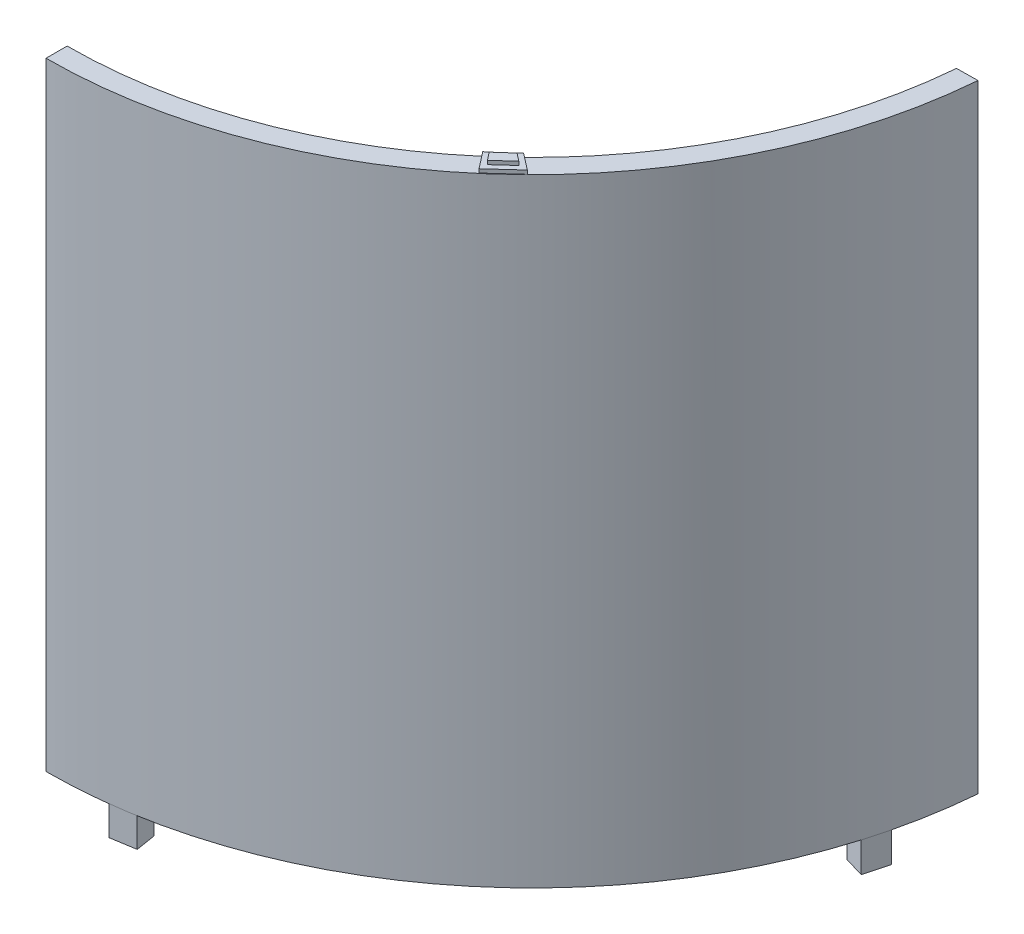
ISO-10303-21;
HEADER;
FILE_DESCRIPTION(('STEP AP214'),'2;1');
FILE_NAME('part.step','',(''),(''),'','','');
FILE_SCHEMA(('AUTOMOTIVE_DESIGN { 1 0 10303 214 1 1 1 1 }'));
ENDSEC;
DATA;
#1=APPLICATION_CONTEXT('core data for automotive mechanical design processes');
#2=APPLICATION_PROTOCOL_DEFINITION('international standard','automotive_design',2000,#1);
#3=PRODUCT_CONTEXT('',#1,'mechanical');
#4=PRODUCT('Part','Part','',(#3));
#5=PRODUCT_RELATED_PRODUCT_CATEGORY('part','',(#4));
#6=PRODUCT_DEFINITION_FORMATION('','',#4);
#7=PRODUCT_DEFINITION_CONTEXT('part definition',#1,'design');
#8=PRODUCT_DEFINITION('design','',#6,#7);
#9=PRODUCT_DEFINITION_SHAPE('','',#8);
#10=(LENGTH_UNIT() NAMED_UNIT(*) SI_UNIT(.MILLI.,.METRE.));
#11=(NAMED_UNIT(*) PLANE_ANGLE_UNIT() SI_UNIT($,.RADIAN.));
#12=(NAMED_UNIT(*) SI_UNIT($,.STERADIAN.) SOLID_ANGLE_UNIT());
#13=UNCERTAINTY_MEASURE_WITH_UNIT(LENGTH_MEASURE(1.E-05),#10,'distance_accuracy_value','');
#14=(GEOMETRIC_REPRESENTATION_CONTEXT(3) GLOBAL_UNCERTAINTY_ASSIGNED_CONTEXT((#13)) GLOBAL_UNIT_ASSIGNED_CONTEXT((#10,
#11,#12)) REPRESENTATION_CONTEXT('',''));
#15=CARTESIAN_POINT('',(0.,0.,0.));
#16=DIRECTION('',(0.,0.,1.));
#17=DIRECTION('',(1.,0.,0.));
#18=AXIS2_PLACEMENT_3D('',#15,#16,#17);
#19=CARTESIAN_POINT('',(0.,0.,0.));
#20=DIRECTION('',(0.,1.,0.));
#21=DIRECTION('',(0.,0.,1.));
#22=AXIS2_PLACEMENT_3D('',#19,#20,#21);
#23=PLANE('',#22);
#24=DIRECTION('',(0.971876517470432,0.,0.235491050338533));
#25=VECTOR('',#24,1.);
#26=CARTESIAN_POINT('',(43.6933956911305,0.,10.5871512061484));
#27=LINE('',#26,#25);
#28=CARTESIAN_POINT('',(43.6933956911305,0.,10.5871512061484));
#29=VERTEX_POINT('',#28);
#30=CARTESIAN_POINT('',(45.675093066908,0.,11.0673274302737));
#31=VERTEX_POINT('',#30);
#32=EDGE_CURVE('E355',#29,#31,#27,.T.);
#33=ORIENTED_EDGE('',*,*,#32,.F.);
#34=CARTESIAN_POINT('',(0.,0.,0.));
#35=DIRECTION('',(0.,-1.,0.));
#36=DIRECTION('',(0.,0.,1.));
#37=AXIS2_PLACEMENT_3D('',#34,#35,#36);
#38=CIRCLE('',#37,44.9577645983822);
#39=CARTESIAN_POINT('',(44.7877184769488,0.,3.90651651898813));
#40=VERTEX_POINT('',#39);
#41=EDGE_CURVE('E534',#40,#29,#38,.T.);
#42=ORIENTED_EDGE('',*,*,#41,.F.);
#43=DIRECTION('',(-0.999921849974526,0.,0.0125017576172964));
#44=VECTOR('',#43,1.);
#45=CARTESIAN_POINT('',(44.7877184769488,0.,3.90651651898813));
#46=LINE('',#45,#44);
#47=CARTESIAN_POINT('',(46.8362941470503,0.,3.880903720859));
#48=VERTEX_POINT('',#47);
#49=EDGE_CURVE('E390',#48,#40,#46,.T.);
#50=ORIENTED_EDGE('',*,*,#49,.F.);
#51=CARTESIAN_POINT('',(0.,0.,0.));
#52=DIRECTION('',(0.,1.,0.));
#53=DIRECTION('',(0.,0.,1.));
#54=AXIS2_PLACEMENT_3D('',#51,#52,#53);
#55=CIRCLE('',#54,46.996806946);
#56=EDGE_CURVE('E383',#31,#48,#55,.T.);
#57=ORIENTED_EDGE('',*,*,#56,.F.);
#58=EDGE_LOOP('',(#33,#42,#50,#57));
#59=FACE_BOUND('',#58,.T.);
#60=ADVANCED_FACE('F194',(#59),#23,.F.);
#61=DIRECTION('',(-0.260127673447546,0.,0.96557422993096));
#62=VECTOR('',#61,1.);
#63=CARTESIAN_POINT('',(45.675093066908,0.,11.0673274302737));
#64=LINE('',#63,#62);
#65=CARTESIAN_POINT('',(45.0533725626075,0.,13.3751068726376));
#66=VERTEX_POINT('',#65);
#67=EDGE_CURVE('E343',#31,#66,#64,.T.);
#68=ORIENTED_EDGE('',*,*,#67,.F.);
#69=EDGE_CURVE('E379',#66,#31,#55,.T.);
#70=ORIENTED_EDGE('',*,*,#69,.F.);
#71=EDGE_LOOP('',(#68,#70));
#72=FACE_BOUND('',#71,.T.);
#73=ADVANCED_FACE('F380',(#72),#23,.F.);
#74=DIRECTION('',(-0.958647522891811,0.,-0.284596076665501));
#75=VECTOR('',#74,1.);
#76=CARTESIAN_POINT('',(45.0533725626075,0.,13.3751068726376));
#77=LINE('',#76,#75);
#78=CARTESIAN_POINT('',(43.0986496669923,0.,12.7948034203508));
#79=VERTEX_POINT('',#78);
#80=EDGE_CURVE('E356',#66,#79,#77,.T.);
#81=ORIENTED_EDGE('',*,*,#80,.F.);
#82=CARTESIAN_POINT('',(0.,0.,46.996806946));
#83=VERTEX_POINT('',#82);
#84=EDGE_CURVE('E372',#83,#66,#55,.T.);
#85=ORIENTED_EDGE('',*,*,#84,.F.);
#86=DIRECTION('',(0.,0.,1.));
#87=VECTOR('',#86,1.);
#88=CARTESIAN_POINT('',(0.,0.,44.9577645983822));
#89=LINE('',#88,#87);
#90=CARTESIAN_POINT('',(0.,0.,44.9577645983822));
#91=VERTEX_POINT('',#90);
#92=EDGE_CURVE('E457',#91,#83,#89,.T.);
#93=ORIENTED_EDGE('',*,*,#92,.F.);
#94=CARTESIAN_POINT('',(6.65795686596446,0.,44.4620310833244));
#95=VERTEX_POINT('',#94);
#96=EDGE_CURVE('E392',#95,#91,#38,.T.);
#97=ORIENTED_EDGE('',*,*,#96,.F.);
#98=DIRECTION('',(0.987163140641952,0.,-0.159715164458223));
#99=VECTOR('',#98,1.);
#100=CARTESIAN_POINT('',(7.70192334124644,0.,44.2931255899729));
#101=LINE('',#100,#99);
#102=CARTESIAN_POINT('',(5.35189982980112,0.,44.6733407501207));
#103=VERTEX_POINT('',#102);
#104=EDGE_CURVE('E219',#103,#95,#101,.T.);
#105=ORIENTED_EDGE('',*,*,#104,.F.);
#106=DIRECTION('',(-0.159715164458223,0.,-0.987163140641952));
#107=VECTOR('',#106,1.);
#108=CARTESIAN_POINT('',(5.35189982980112,0.,44.6733407501207));
#109=LINE('',#108,#107);
#110=CARTESIAN_POINT('',(5.66110665279664,0.,46.5844778643177));
#111=VERTEX_POINT('',#110);
#112=EDGE_CURVE('E564',#111,#103,#109,.T.);
#113=ORIENTED_EDGE('',*,*,#112,.F.);
#114=DIRECTION('',(-0.987163140641952,0.,0.159715164458223));
#115=VECTOR('',#114,1.);
#116=CARTESIAN_POINT('',(5.66110665279664,0.,46.5844778643177));
#117=LINE('',#116,#115);
#118=CARTESIAN_POINT('',(8.01113016424196,0.,46.2042627041699));
#119=VERTEX_POINT('',#118);
#120=EDGE_CURVE('E571',#119,#111,#117,.T.);
#121=ORIENTED_EDGE('',*,*,#120,.F.);
#122=DIRECTION('',(0.159715164458223,0.,0.987163140641952));
#123=VECTOR('',#122,1.);
#124=CARTESIAN_POINT('',(8.01113016424196,0.,46.2042627041699));
#125=LINE('',#124,#123);
#126=CARTESIAN_POINT('',(7.70192334124497,0.,44.2931255899732));
#127=VERTEX_POINT('',#126);
#128=EDGE_CURVE('E574',#127,#119,#125,.T.);
#129=ORIENTED_EDGE('',*,*,#128,.F.);
#130=EDGE_CURVE('E198',#79,#127,#38,.T.);
#131=ORIENTED_EDGE('',*,*,#130,.F.);
#132=EDGE_LOOP('',(#81,#85,#93,#97,#105,#113,#121,#129,#131));
#133=FACE_BOUND('',#132,.T.);
#134=ADVANCED_FACE('F369',(#133),#23,.F.);
#135=CARTESIAN_POINT('',(0.,59.622930538,0.));
#136=DIRECTION('',(0.,1.,0.));
#137=DIRECTION('',(0.,0.,1.));
#138=AXIS2_PLACEMENT_3D('',#135,#136,#137);
#139=PLANE('',#138);
#140=CARTESIAN_POINT('',(0.,59.622930538,0.));
#141=DIRECTION('',(0.,-1.,0.));
#142=DIRECTION('',(0.,0.,1.));
#143=AXIS2_PLACEMENT_3D('',#140,#141,#142);
#144=CIRCLE('',#143,44.9577645983822);
#145=CARTESIAN_POINT('',(44.7877184769488,59.622930538,3.90651651898813));
#146=VERTEX_POINT('',#145);
#147=CARTESIAN_POINT('',(31.3359106757,59.622930538,32.2375758984465));
#148=VERTEX_POINT('',#147);
#149=EDGE_CURVE('E469',#146,#148,#144,.T.);
#150=ORIENTED_EDGE('',*,*,#149,.T.);
#151=DIRECTION('',(0.79089169625054,0.,0.611956146142796));
#152=VECTOR('',#151,1.);
#153=CARTESIAN_POINT('',(31.3359106757,59.622930538,32.2375758984465));
#154=LINE('',#153,#152);
#155=CARTESIAN_POINT('',(32.9319416248508,59.622930538,33.4725123042746));
#156=VERTEX_POINT('',#155);
#157=EDGE_CURVE('E408',#148,#156,#154,.T.);
#158=ORIENTED_EDGE('',*,*,#157,.T.);
#159=DIRECTION('',(-0.739524969403038,0.,0.673129125524543));
#160=VECTOR('',#159,1.);
#161=CARTESIAN_POINT('',(32.9319416248508,59.622930538,33.4725123042746));
#162=LINE('',#161,#160);
#163=CARTESIAN_POINT('',(30.4908808828723,59.622930538,35.6944103477264));
#164=VERTEX_POINT('',#163);
#165=EDGE_CURVE('E709',#156,#164,#162,.T.);
#166=ORIENTED_EDGE('',*,*,#165,.T.);
#167=DIRECTION('',(-0.612992155064147,0.,-0.790088993613892));
#168=VECTOR('',#167,1.);
#169=CARTESIAN_POINT('',(29.2476680121748,59.622930538,34.0920263730826));
#170=LINE('',#169,#168);
#171=CARTESIAN_POINT('',(29.2716246217053,59.622930538,34.1229041801768));
#172=VERTEX_POINT('',#171);
#173=EDGE_CURVE('E484',#164,#172,#170,.T.);
#174=ORIENTED_EDGE('',*,*,#173,.T.);
#175=CARTESIAN_POINT('',(0.,59.622930538,44.9577645983822));
#176=VERTEX_POINT('',#175);
#177=EDGE_CURVE('E460',#172,#176,#144,.T.);
#178=ORIENTED_EDGE('',*,*,#177,.T.);
#179=DIRECTION('',(0.,0.,1.));
#180=VECTOR('',#179,1.);
#181=CARTESIAN_POINT('',(0.,59.622930538,44.9577645983822));
#182=LINE('',#181,#180);
#183=CARTESIAN_POINT('',(0.,59.622930538,46.996806946));
#184=VERTEX_POINT('',#183);
#185=EDGE_CURVE('E462',#176,#184,#182,.T.);
#186=ORIENTED_EDGE('',*,*,#185,.T.);
#187=CARTESIAN_POINT('',(0.,59.622930538,0.));
#188=DIRECTION('',(0.,1.,0.));
#189=DIRECTION('',(0.,0.,1.));
#190=AXIS2_PLACEMENT_3D('',#187,#188,#189);
#191=CIRCLE('',#190,46.996806946);
#192=CARTESIAN_POINT('',(46.8362941470503,59.622930538,3.880903720859));
#193=VERTEX_POINT('',#192);
#194=EDGE_CURVE('E447',#184,#193,#191,.T.);
#195=ORIENTED_EDGE('',*,*,#194,.T.);
#196=DIRECTION('',(-0.999921849974526,0.,0.0125017576172964));
#197=VECTOR('',#196,1.);
#198=CARTESIAN_POINT('',(44.7877184769488,59.622930538,3.90651651898813));
#199=LINE('',#198,#197);
#200=EDGE_CURVE('E456',#193,#146,#199,.T.);
#201=ORIENTED_EDGE('',*,*,#200,.T.);
#202=EDGE_LOOP('',(#150,#158,#166,#174,#178,#186,#195,#201));
#203=FACE_BOUND('',#202,.T.);
#204=ADVANCED_FACE('F481',(#203),#139,.T.);
#205=CARTESIAN_POINT('',(0.,59.622930538,0.));
#206=DIRECTION('',(0.,-1.,0.));
#207=DIRECTION('',(0.,0.,-1.));
#208=AXIS2_PLACEMENT_3D('',#205,#206,#207);
#209=CYLINDRICAL_SURFACE('',#208,46.996806946);
#210=ORIENTED_EDGE('',*,*,#84,.T.);
#211=ORIENTED_EDGE('',*,*,#69,.T.);
#212=ORIENTED_EDGE('',*,*,#56,.T.);
#213=DIRECTION('',(0.,-1.,0.));
#214=VECTOR('',#213,1.);
#215=CARTESIAN_POINT('',(46.8362941470503,59.622930538,3.880903720859));
#216=LINE('',#215,#214);
#217=EDGE_CURVE('E205',#193,#48,#216,.T.);
#218=ORIENTED_EDGE('',*,*,#217,.F.);
#219=ORIENTED_EDGE('',*,*,#194,.F.);
#220=DIRECTION('',(0.,-1.,0.));
#221=VECTOR('',#220,1.);
#222=CARTESIAN_POINT('',(0.,59.622930538,46.996806946));
#223=LINE('',#222,#221);
#224=EDGE_CURVE('E388',#184,#83,#223,.T.);
#225=ORIENTED_EDGE('',*,*,#224,.T.);
#226=EDGE_LOOP('',(#210,#211,#212,#218,#219,#225));
#227=FACE_BOUND('',#226,.T.);
#228=ADVANCED_FACE('F196',(#227),#209,.T.);
#229=CARTESIAN_POINT('',(44.7877184769488,59.622930538,3.90651651898813));
#230=DIRECTION('',(0.0125017576172964,0.,0.999921849974526));
#231=DIRECTION('',(0.999921849974526,0.,-0.0125017576172964));
#232=AXIS2_PLACEMENT_3D('',#229,#230,#231);
#233=PLANE('',#232);
#234=ORIENTED_EDGE('',*,*,#49,.T.);
#235=DIRECTION('',(0.,-1.,0.));
#236=VECTOR('',#235,1.);
#237=CARTESIAN_POINT('',(44.7877184769488,59.622930538,3.90651651898813));
#238=LINE('',#237,#236);
#239=EDGE_CURVE('E493',#146,#40,#238,.T.);
#240=ORIENTED_EDGE('',*,*,#239,.F.);
#241=ORIENTED_EDGE('',*,*,#200,.F.);
#242=ORIENTED_EDGE('',*,*,#217,.T.);
#243=EDGE_LOOP('',(#234,#240,#241,#242));
#244=FACE_BOUND('',#243,.T.);
#245=ADVANCED_FACE('F508',(#244),#233,.F.);
#246=CARTESIAN_POINT('',(0.,59.622930538,0.));
#247=DIRECTION('',(0.,-1.,0.));
#248=DIRECTION('',(0.,0.,-1.));
#249=AXIS2_PLACEMENT_3D('',#246,#247,#248);
#250=CYLINDRICAL_SURFACE('',#249,44.9577645983822);
#251=ORIENTED_EDGE('',*,*,#41,.T.);
#252=EDGE_CURVE('E542',#29,#79,#38,.T.);
#253=ORIENTED_EDGE('',*,*,#252,.T.);
#254=ORIENTED_EDGE('',*,*,#130,.T.);
#255=CARTESIAN_POINT('',(0.,0.,0.));
#256=DIRECTION('',(0.,-1.,0.));
#257=DIRECTION('',(0.171314641865493,0.,0.985216368866504));
#258=AXIS2_PLACEMENT_3D('',#255,#256,#257);
#259=CIRCLE('',#258,44.9577645983822);
#260=EDGE_CURVE('E549',#127,#95,#259,.T.);
#261=ORIENTED_EDGE('',*,*,#260,.T.);
#262=ORIENTED_EDGE('',*,*,#96,.T.);
#263=DIRECTION('',(0.,-1.,0.));
#264=VECTOR('',#263,1.);
#265=CARTESIAN_POINT('',(0.,59.622930538,44.9577645983822));
#266=LINE('',#265,#264);
#267=EDGE_CURVE('E487',#176,#91,#266,.T.);
#268=ORIENTED_EDGE('',*,*,#267,.F.);
#269=ORIENTED_EDGE('',*,*,#177,.F.);
#270=CARTESIAN_POINT('',(30.37739577073,59.622930538,33.142335824018));
#271=VERTEX_POINT('',#270);
#272=EDGE_CURVE('E473',#271,#172,#144,.T.);
#273=ORIENTED_EDGE('',*,*,#272,.F.);
#274=CARTESIAN_POINT('',(31.3359106757,59.622930538,32.2375758984465));
#275=CARTESIAN_POINT('',(30.8685489057334,59.622930538,32.7033074867842));
#276=CARTESIAN_POINT('',(30.37739577073,59.622930538,33.142335824018));
#277=B_SPLINE_CURVE_WITH_KNOTS('',2,(#274,#275,#276),.UNSPECIFIED.,.F.,.F.,(3,3),
(0.528237604569855,1.),.UNSPECIFIED.);
#278=EDGE_CURVE('E14',#148,#271,#277,.T.);
#279=ORIENTED_EDGE('',*,*,#278,.F.);
#280=ORIENTED_EDGE('',*,*,#149,.F.);
#281=ORIENTED_EDGE('',*,*,#239,.T.);
#282=EDGE_LOOP('',(#251,#253,#254,#261,#262,#268,#269,#273,#279,#280,#281));
#283=FACE_BOUND('',#282,.T.);
#284=ADVANCED_FACE('F489',(#283),#250,.F.);
#285=CARTESIAN_POINT('',(0.,59.622930538,44.9577645983822));
#286=DIRECTION('',(1.,0.,0.));
#287=DIRECTION('',(0.,0.,-1.));
#288=AXIS2_PLACEMENT_3D('',#285,#286,#287);
#289=PLANE('',#288);
#290=ORIENTED_EDGE('',*,*,#92,.T.);
#291=ORIENTED_EDGE('',*,*,#224,.F.);
#292=ORIENTED_EDGE('',*,*,#185,.F.);
#293=ORIENTED_EDGE('',*,*,#267,.T.);
#294=EDGE_LOOP('',(#290,#291,#292,#293));
#295=FACE_BOUND('',#294,.T.);
#296=ADVANCED_FACE('F495',(#295),#289,.F.);
#297=CARTESIAN_POINT('',(0.,59.6229305380002,0.));
#298=DIRECTION('',(0.,1.,0.));
#299=DIRECTION('',(0.,0.,1.));
#300=AXIS2_PLACEMENT_3D('',#297,#298,#299);
#301=PLANE('',#300);
#302=CARTESIAN_POINT('',(29.2476680121748,59.622930538,34.0920263730826));
#303=CARTESIAN_POINT('',(30.3452387304711,59.622930538,33.2247923295336));
#304=CARTESIAN_POINT('',(31.3359106757,59.622930538,32.2375758984465));
#305=B_SPLINE_CURVE_WITH_KNOTS('',2,(#302,#303,#304),.UNSPECIFIED.,.F.,.F.,(3,3),(0.,1.),.UNSPECIFIED.);
#306=CARTESIAN_POINT('',(29.2476680121748,59.622930538,34.0920263730826));
#307=VERTEX_POINT('',#306);
#308=EDGE_CURVE('E396',#307,#271,#305,.T.);
#309=ORIENTED_EDGE('',*,*,#308,.T.);
#310=ORIENTED_EDGE('',*,*,#272,.T.);
#311=EDGE_CURVE('E736',#172,#307,#170,.T.);
#312=ORIENTED_EDGE('',*,*,#311,.T.);
#313=EDGE_LOOP('',(#309,#310,#312));
#314=FACE_BOUND('',#313,.T.);
#315=ADVANCED_FACE('F439',(#314),#301,.F.);
#316=CARTESIAN_POINT('',(0.,59.9825252380002,0.));
#317=DIRECTION('',(0.,1.,0.));
#318=DIRECTION('',(0.,0.,1.));
#319=AXIS2_PLACEMENT_3D('',#316,#317,#318);
#320=PLANE('',#319);
#321=CARTESIAN_POINT('',(31.3752508033412,59.9825252380002,32.9103284828037));
#322=CARTESIAN_POINT('',(31.3491587800157,59.9825252380002,32.9353237229431));
#323=CARTESIAN_POINT('',(31.3230149632518,59.9825252380002,32.960265464837));
#324=CARTESIAN_POINT('',(31.2968248369246,59.9825252380002,32.9851589341973));
#325=CARTESIAN_POINT('',(31.1711972969571,59.9825252380002,33.1041747232081));
#326=CARTESIAN_POINT('',(31.0447591125012,59.9825252380002,33.2223229994474));
#327=CARTESIAN_POINT('',(30.9441488696777,59.9825252380002,33.3151791560881));
#328=CARTESIAN_POINT('',(30.7332127299382,59.9825252380002,33.5071695557994));
#329=CARTESIAN_POINT('',(30.5192300579891,59.9825252380002,33.6957640894488));
#330=CARTESIAN_POINT('',(30.4072221592275,59.9825252380002,33.793006773364));
#331=CARTESIAN_POINT('',(30.249718722762,59.9825252380002,33.9279314173744));
#332=CARTESIAN_POINT('',(30.0911265944853,59.9825252380002,34.0615888230446));
#333=CARTESIAN_POINT('',(30.0458628188562,59.9825252380002,34.0995240516828));
#334=CARTESIAN_POINT('',(30.0004790515619,59.9825252380002,34.1373136995801));
#335=CARTESIAN_POINT('',(29.954959434773,59.9825252380002,34.1749363530456));
#336=B_SPLINE_CURVE_WITH_KNOTS('',5,(#321,#322,#323,#324,#325,#326,#327,#328,#329,#330,#331,
#332,#333,#334,#335),.UNSPECIFIED.,.F.,.F.,(6,3,3,3,6),(0.,0.0949769551696104,0.45487183326193,
0.844772921526779,1.),.UNSPECIFIED.);
#337=CARTESIAN_POINT('',(31.3752508033412,59.9825252380002,32.9103284828037));
#338=VERTEX_POINT('',#337);
#339=CARTESIAN_POINT('',(29.954959434773,59.9825252380002,34.1749363530456));
#340=VERTEX_POINT('',#339);
#341=EDGE_CURVE('E692',#338,#340,#336,.T.);
#342=ORIENTED_EDGE('',*,*,#341,.F.);
#343=DIRECTION('',(-0.790891696060792,0.,-0.611956146388026));
#344=VECTOR('',#343,1.);
#345=CARTESIAN_POINT('',(32.1425937650942,59.9825252380002,33.5040636859563));
#346=LINE('',#345,#344);
#347=CARTESIAN_POINT('',(32.1425937650942,59.9825252380002,33.5040636859563));
#348=VERTEX_POINT('',#347);
#349=EDGE_CURVE('E792',#348,#338,#346,.T.);
#350=ORIENTED_EDGE('',*,*,#349,.F.);
#351=DIRECTION('',(0.739524969403045,0.,-0.673129125524535));
#352=VECTOR('',#351,1.);
#353=CARTESIAN_POINT('',(30.5553585685998,59.9825252380002,34.9487941332331));
#354=LINE('',#353,#352);
#355=CARTESIAN_POINT('',(30.5553585685998,59.9825252380002,34.9487941332331));
#356=VERTEX_POINT('',#355);
#357=EDGE_CURVE('E758',#356,#348,#354,.T.);
#358=ORIENTED_EDGE('',*,*,#357,.F.);
#359=DIRECTION('',(0.612992154274853,0.,0.790088994226267));
#360=VECTOR('',#359,1.);
#361=CARTESIAN_POINT('',(29.954959434773,59.9825252380002,34.1749363530456));
#362=LINE('',#361,#360);
#363=EDGE_CURVE('E744',#340,#356,#362,.T.);
#364=ORIENTED_EDGE('',*,*,#363,.F.);
#365=EDGE_LOOP('',(#342,#350,#358,#364));
#366=FACE_BOUND('',#365,.T.);
#367=CARTESIAN_POINT('',(29.2476680121748,59.982525238,34.0920263730826));
#368=CARTESIAN_POINT('',(30.3452387304711,59.982525238,33.2247923295336));
#369=CARTESIAN_POINT('',(31.3359106757,59.982525238,32.2375758984465));
#370=B_SPLINE_CURVE_WITH_KNOTS('',2,(#367,#368,#369),.UNSPECIFIED.,.F.,.F.,(3,3),(0.,1.),.UNSPECIFIED.);
#371=CARTESIAN_POINT('',(29.2476680121748,59.982525238,34.0920263730826));
#372=VERTEX_POINT('',#371);
#373=CARTESIAN_POINT('',(31.3359106757,59.982525238,32.2375758984465));
#374=VERTEX_POINT('',#373);
#375=EDGE_CURVE('E401',#372,#374,#370,.T.);
#376=ORIENTED_EDGE('',*,*,#375,.F.);
#377=DIRECTION('',(-0.612992155064147,0.,-0.790088993613892));
#378=VECTOR('',#377,1.);
#379=CARTESIAN_POINT('',(29.2476680121748,59.982525238,34.0920263730826));
#380=LINE('',#379,#378);
#381=CARTESIAN_POINT('',(30.4908808828723,59.982525238,35.6944103477264));
#382=VERTEX_POINT('',#381);
#383=EDGE_CURVE('E698',#382,#372,#380,.T.);
#384=ORIENTED_EDGE('',*,*,#383,.F.);
#385=DIRECTION('',(-0.739524969403038,0.,0.673129125524543));
#386=VECTOR('',#385,1.);
#387=CARTESIAN_POINT('',(32.9319416248508,59.982525238,33.4725123042746));
#388=LINE('',#387,#386);
#389=CARTESIAN_POINT('',(32.9319416248508,59.982525238,33.4725123042746));
#390=VERTEX_POINT('',#389);
#391=EDGE_CURVE('E723',#390,#382,#388,.T.);
#392=ORIENTED_EDGE('',*,*,#391,.F.);
#393=DIRECTION('',(0.79089169625054,0.,0.611956146142796));
#394=VECTOR('',#393,1.);
#395=CARTESIAN_POINT('',(31.3359106757,59.982525238,32.2375758984465));
#396=LINE('',#395,#394);
#397=EDGE_CURVE('E699',#374,#390,#396,.T.);
#398=ORIENTED_EDGE('',*,*,#397,.F.);
#399=EDGE_LOOP('',(#376,#384,#392,#398));
#400=FACE_BOUND('',#399,.T.);
#401=ADVANCED_FACE('F625',(#366,#400),#320,.T.);
#402=CARTESIAN_POINT('',(29.2476680121748,59.622930538,34.0920263730826));
#403=DIRECTION('',(0.790088993613892,0.,-0.612992155064147));
#404=DIRECTION('',(-0.612992155064147,0.,-0.790088993613892));
#405=AXIS2_PLACEMENT_3D('',#402,#403,#404);
#406=PLANE('',#405);
#407=ORIENTED_EDGE('',*,*,#383,.T.);
#408=DIRECTION('',(0.,1.,0.));
#409=VECTOR('',#408,1.);
#410=CARTESIAN_POINT('',(29.2476680121748,59.622930538,34.0920263730826));
#411=LINE('',#410,#409);
#412=EDGE_CURVE('E424',#307,#372,#411,.T.);
#413=ORIENTED_EDGE('',*,*,#412,.F.);
#414=ORIENTED_EDGE('',*,*,#311,.F.);
#415=ORIENTED_EDGE('',*,*,#173,.F.);
#416=DIRECTION('',(0.,1.,0.));
#417=VECTOR('',#416,1.);
#418=CARTESIAN_POINT('',(30.4908808828723,59.622930538,35.6944103477264));
#419=LINE('',#418,#417);
#420=EDGE_CURVE('E732',#164,#382,#419,.T.);
#421=ORIENTED_EDGE('',*,*,#420,.T.);
#422=EDGE_LOOP('',(#407,#413,#414,#415,#421));
#423=FACE_BOUND('',#422,.T.);
#424=ADVANCED_FACE('F629',(#423),#406,.F.);
#425=CARTESIAN_POINT('',(32.9319416248508,59.622930538,33.4725123042746));
#426=DIRECTION('',(-0.673129125524543,0.,-0.739524969403037));
#427=DIRECTION('',(-0.739524969403038,0.,0.673129125524543));
#428=AXIS2_PLACEMENT_3D('',#425,#426,#427);
#429=PLANE('',#428);
#430=ORIENTED_EDGE('',*,*,#391,.T.);
#431=ORIENTED_EDGE('',*,*,#420,.F.);
#432=ORIENTED_EDGE('',*,*,#165,.F.);
#433=DIRECTION('',(0.,1.,0.));
#434=VECTOR('',#433,1.);
#435=CARTESIAN_POINT('',(32.9319416248508,59.622930538,33.4725123042746));
#436=LINE('',#435,#434);
#437=EDGE_CURVE('E712',#156,#390,#436,.T.);
#438=ORIENTED_EDGE('',*,*,#437,.T.);
#439=EDGE_LOOP('',(#430,#431,#432,#438));
#440=FACE_BOUND('',#439,.T.);
#441=ADVANCED_FACE('F631',(#440),#429,.F.);
#442=CARTESIAN_POINT('',(31.3359106757,59.622930538,32.2375758984465));
#443=DIRECTION('',(-0.611956146142796,0.,0.79089169625054));
#444=DIRECTION('',(0.79089169625054,0.,0.611956146142796));
#445=AXIS2_PLACEMENT_3D('',#442,#443,#444);
#446=PLANE('',#445);
#447=ORIENTED_EDGE('',*,*,#397,.T.);
#448=ORIENTED_EDGE('',*,*,#437,.F.);
#449=ORIENTED_EDGE('',*,*,#157,.F.);
#450=DIRECTION('',(0.,1.,0.));
#451=VECTOR('',#450,1.);
#452=CARTESIAN_POINT('',(31.3359106757,59.622930538,32.2375758984465));
#453=LINE('',#452,#451);
#454=EDGE_CURVE('E415',#148,#374,#453,.T.);
#455=ORIENTED_EDGE('',*,*,#454,.T.);
#456=EDGE_LOOP('',(#447,#448,#449,#455));
#457=FACE_BOUND('',#456,.T.);
#458=ADVANCED_FACE('F437',(#457),#446,.F.);
#459=DIRECTION('',(0.,1.,0.));
#460=VECTOR('',#459,1.);
#461=SURFACE_OF_LINEAR_EXTRUSION('',#305,#460);
#462=ORIENTED_EDGE('',*,*,#375,.T.);
#463=ORIENTED_EDGE('',*,*,#454,.F.);
#464=ORIENTED_EDGE('',*,*,#278,.T.);
#465=ORIENTED_EDGE('',*,*,#308,.F.);
#466=ORIENTED_EDGE('',*,*,#412,.T.);
#467=EDGE_LOOP('',(#462,#463,#464,#465,#466));
#468=FACE_BOUND('',#467,.T.);
#469=ADVANCED_FACE('F431',(#468),#461,.F.);
#470=CARTESIAN_POINT('',(0.,60.3421199380002,0.));
#471=DIRECTION('',(0.,1.,0.));
#472=DIRECTION('',(0.,0.,1.));
#473=AXIS2_PLACEMENT_3D('',#470,#471,#472);
#474=PLANE('',#473);
#475=CARTESIAN_POINT('',(31.3752508033412,60.3421199380002,32.9103284828037));
#476=CARTESIAN_POINT('',(31.3491587800157,60.3421199380002,32.9353237229431));
#477=CARTESIAN_POINT('',(31.3230149632518,60.3421199380002,32.960265464837));
#478=CARTESIAN_POINT('',(31.2968248369246,60.3421199380002,32.9851589341973));
#479=CARTESIAN_POINT('',(31.1711972969571,60.3421199380002,33.1041747232081));
#480=CARTESIAN_POINT('',(31.0447591125012,60.3421199380002,33.2223229994474));
#481=CARTESIAN_POINT('',(30.9441488696777,60.3421199380002,33.3151791560881));
#482=CARTESIAN_POINT('',(30.7332127299382,60.3421199380002,33.5071695557994));
#483=CARTESIAN_POINT('',(30.5192300579891,60.3421199380002,33.6957640894488));
#484=CARTESIAN_POINT('',(30.4072221592275,60.3421199380002,33.793006773364));
#485=CARTESIAN_POINT('',(30.249718722762,60.3421199380002,33.9279314173744));
#486=CARTESIAN_POINT('',(30.0911265944853,60.3421199380002,34.0615888230446));
#487=CARTESIAN_POINT('',(30.0458628188562,60.3421199380002,34.0995240516828));
#488=CARTESIAN_POINT('',(30.0004790515619,60.3421199380002,34.1373136995801));
#489=CARTESIAN_POINT('',(29.954959434773,60.3421199380002,34.1749363530456));
#490=B_SPLINE_CURVE_WITH_KNOTS('',5,(#475,#476,#477,#478,#479,#480,#481,#482,#483,#484,#485,
#486,#487,#488,#489),.UNSPECIFIED.,.F.,.F.,(6,3,3,3,6),(0.,0.0949769551696104,0.45487183326193,
0.844772921526779,1.),.UNSPECIFIED.);
#491=CARTESIAN_POINT('',(31.3752508033412,60.3421199380002,32.9103284828037));
#492=VERTEX_POINT('',#491);
#493=CARTESIAN_POINT('',(29.954959434773,60.3421199380002,34.1749363530456));
#494=VERTEX_POINT('',#493);
#495=EDGE_CURVE('E776',#492,#494,#490,.T.);
#496=ORIENTED_EDGE('',*,*,#495,.T.);
#497=DIRECTION('',(0.612992154274853,0.,0.790088994226267));
#498=VECTOR('',#497,1.);
#499=CARTESIAN_POINT('',(29.954959434773,60.3421199380002,34.1749363530456));
#500=LINE('',#499,#498);
#501=CARTESIAN_POINT('',(30.5553585685998,60.3421199380002,34.9487941332331));
#502=VERTEX_POINT('',#501);
#503=EDGE_CURVE('E748',#494,#502,#500,.T.);
#504=ORIENTED_EDGE('',*,*,#503,.T.);
#505=DIRECTION('',(0.739524969403045,0.,-0.673129125524535));
#506=VECTOR('',#505,1.);
#507=CARTESIAN_POINT('',(30.5553585685998,60.3421199380002,34.9487941332331));
#508=LINE('',#507,#506);
#509=CARTESIAN_POINT('',(32.1425937650942,60.3421199380002,33.5040636859563));
#510=VERTEX_POINT('',#509);
#511=EDGE_CURVE('E768',#502,#510,#508,.T.);
#512=ORIENTED_EDGE('',*,*,#511,.T.);
#513=DIRECTION('',(-0.790891696060792,0.,-0.611956146388026));
#514=VECTOR('',#513,1.);
#515=CARTESIAN_POINT('',(32.1425937650942,60.3421199380002,33.5040636859563));
#516=LINE('',#515,#514);
#517=EDGE_CURVE('E799',#510,#492,#516,.T.);
#518=ORIENTED_EDGE('',*,*,#517,.T.);
#519=EDGE_LOOP('',(#496,#504,#512,#518));
#520=FACE_BOUND('',#519,.T.);
#521=ADVANCED_FACE('F436',(#520),#474,.T.);
#522=DIRECTION('',(0.,1.,0.));
#523=VECTOR('',#522,1.);
#524=SURFACE_OF_LINEAR_EXTRUSION('',#336,#523);
#525=ORIENTED_EDGE('',*,*,#495,.F.);
#526=DIRECTION('',(0.,1.,0.));
#527=VECTOR('',#526,1.);
#528=CARTESIAN_POINT('',(31.3752508033412,59.9825252380002,32.9103284828037));
#529=LINE('',#528,#527);
#530=EDGE_CURVE('E779',#338,#492,#529,.T.);
#531=ORIENTED_EDGE('',*,*,#530,.F.);
#532=ORIENTED_EDGE('',*,*,#341,.T.);
#533=DIRECTION('',(0.,1.,0.));
#534=VECTOR('',#533,1.);
#535=CARTESIAN_POINT('',(29.954959434773,59.9825252380002,34.1749363530456));
#536=LINE('',#535,#534);
#537=EDGE_CURVE('E809',#340,#494,#536,.T.);
#538=ORIENTED_EDGE('',*,*,#537,.T.);
#539=EDGE_LOOP('',(#525,#531,#532,#538));
#540=FACE_BOUND('',#539,.T.);
#541=ADVANCED_FACE('F610',(#540),#524,.T.);
#542=CARTESIAN_POINT('',(32.1425937650942,59.9825252380002,33.5040636859563));
#543=DIRECTION('',(0.611956146388026,0.,-0.790891696060792));
#544=DIRECTION('',(-0.790891696060792,0.,-0.611956146388026));
#545=AXIS2_PLACEMENT_3D('',#542,#543,#544);
#546=PLANE('',#545);
#547=ORIENTED_EDGE('',*,*,#517,.F.);
#548=DIRECTION('',(0.,1.,0.));
#549=VECTOR('',#548,1.);
#550=CARTESIAN_POINT('',(32.1425937650942,59.9825252380002,33.5040636859563));
#551=LINE('',#550,#549);
#552=EDGE_CURVE('E795',#348,#510,#551,.T.);
#553=ORIENTED_EDGE('',*,*,#552,.F.);
#554=ORIENTED_EDGE('',*,*,#349,.T.);
#555=ORIENTED_EDGE('',*,*,#530,.T.);
#556=EDGE_LOOP('',(#547,#553,#554,#555));
#557=FACE_BOUND('',#556,.T.);
#558=ADVANCED_FACE('F613',(#557),#546,.T.);
#559=CARTESIAN_POINT('',(30.5553585685998,59.9825252380002,34.9487941332331));
#560=DIRECTION('',(0.673129125524535,0.,0.739524969403045));
#561=DIRECTION('',(0.739524969403045,0.,-0.673129125524535));
#562=AXIS2_PLACEMENT_3D('',#559,#560,#561);
#563=PLANE('',#562);
#564=ORIENTED_EDGE('',*,*,#511,.F.);
#565=DIRECTION('',(0.,1.,0.));
#566=VECTOR('',#565,1.);
#567=CARTESIAN_POINT('',(30.5553585685998,59.9825252380002,34.9487941332331));
#568=LINE('',#567,#566);
#569=EDGE_CURVE('E765',#356,#502,#568,.T.);
#570=ORIENTED_EDGE('',*,*,#569,.F.);
#571=ORIENTED_EDGE('',*,*,#357,.T.);
#572=ORIENTED_EDGE('',*,*,#552,.T.);
#573=EDGE_LOOP('',(#564,#570,#571,#572));
#574=FACE_BOUND('',#573,.T.);
#575=ADVANCED_FACE('F617',(#574),#563,.T.);
#576=CARTESIAN_POINT('',(29.954959434773,59.9825252380002,34.1749363530456));
#577=DIRECTION('',(-0.790088994226267,0.,0.612992154274853));
#578=DIRECTION('',(0.612992154274853,0.,0.790088994226267));
#579=AXIS2_PLACEMENT_3D('',#576,#577,#578);
#580=PLANE('',#579);
#581=ORIENTED_EDGE('',*,*,#503,.F.);
#582=ORIENTED_EDGE('',*,*,#537,.F.);
#583=ORIENTED_EDGE('',*,*,#363,.T.);
#584=ORIENTED_EDGE('',*,*,#569,.T.);
#585=EDGE_LOOP('',(#581,#582,#583,#584));
#586=FACE_BOUND('',#585,.T.);
#587=ADVANCED_FACE('F608',(#586),#580,.T.);
#588=CARTESIAN_POINT('',(8.01113016424196,-2.89959469999999,46.2042627041699));
#589=DIRECTION('',(-0.987163140641952,0.,0.159715164458223));
#590=DIRECTION('',(0.159715164458223,0.,0.987163140641952));
#591=AXIS2_PLACEMENT_3D('',#588,#589,#590);
#592=PLANE('',#591);
#593=ORIENTED_EDGE('',*,*,#128,.T.);
#594=DIRECTION('',(0.,1.,0.));
#595=VECTOR('',#594,1.);
#596=CARTESIAN_POINT('',(8.01113016424196,-2.89959469999999,46.2042627041699));
#597=LINE('',#596,#595);
#598=CARTESIAN_POINT('',(8.01113016424196,-2.89959469999999,46.2042627041699));
#599=VERTEX_POINT('',#598);
#600=EDGE_CURVE('E780',#599,#119,#597,.T.);
#601=ORIENTED_EDGE('',*,*,#600,.F.);
#602=DIRECTION('',(0.159715164458223,0.,0.987163140641952));
#603=VECTOR('',#602,1.);
#604=CARTESIAN_POINT('',(8.01113016424196,-2.89959469999999,46.2042627041699));
#605=LINE('',#604,#603);
#606=CARTESIAN_POINT('',(7.70192334124644,-2.89959469999999,44.2931255899729));
#607=VERTEX_POINT('',#606);
#608=EDGE_CURVE('E563',#607,#599,#605,.T.);
#609=ORIENTED_EDGE('',*,*,#608,.F.);
#610=DIRECTION('',(0.,1.,0.));
#611=VECTOR('',#610,1.);
#612=CARTESIAN_POINT('',(7.70192334124644,-2.89959469999999,44.2931255899729));
#613=LINE('',#612,#611);
#614=EDGE_CURVE('E832',#607,#127,#613,.T.);
#615=ORIENTED_EDGE('',*,*,#614,.T.);
#616=EDGE_LOOP('',(#593,#601,#609,#615));
#617=FACE_BOUND('',#616,.T.);
#618=ADVANCED_FACE('F604',(#617),#592,.F.);
#619=CARTESIAN_POINT('',(5.66110665279664,-2.89959469999999,46.5844778643177));
#620=DIRECTION('',(-0.159715164458223,0.,-0.987163140641952));
#621=DIRECTION('',(-0.987163140641952,0.,0.159715164458223));
#622=AXIS2_PLACEMENT_3D('',#619,#620,#621);
#623=PLANE('',#622);
#624=ORIENTED_EDGE('',*,*,#120,.T.);
#625=DIRECTION('',(0.,1.,0.));
#626=VECTOR('',#625,1.);
#627=CARTESIAN_POINT('',(5.66110665279664,-2.89959469999999,46.5844778643177));
#628=LINE('',#627,#626);
#629=CARTESIAN_POINT('',(5.66110665279664,-2.89959469999999,46.5844778643177));
#630=VERTEX_POINT('',#629);
#631=EDGE_CURVE('E826',#630,#111,#628,.T.);
#632=ORIENTED_EDGE('',*,*,#631,.F.);
#633=DIRECTION('',(-0.987163140641952,0.,0.159715164458223));
#634=VECTOR('',#633,1.);
#635=CARTESIAN_POINT('',(5.66110665279664,-2.89959469999999,46.5844778643177));
#636=LINE('',#635,#634);
#637=EDGE_CURVE('E569',#599,#630,#636,.T.);
#638=ORIENTED_EDGE('',*,*,#637,.F.);
#639=ORIENTED_EDGE('',*,*,#600,.T.);
#640=EDGE_LOOP('',(#624,#632,#638,#639));
#641=FACE_BOUND('',#640,.T.);
#642=ADVANCED_FACE('F600',(#641),#623,.F.);
#643=CARTESIAN_POINT('',(5.35189982980112,-2.89959469999999,44.6733407501207));
#644=DIRECTION('',(0.987163140641952,0.,-0.159715164458223));
#645=DIRECTION('',(-0.159715164458223,0.,-0.987163140641952));
#646=AXIS2_PLACEMENT_3D('',#643,#644,#645);
#647=PLANE('',#646);
#648=ORIENTED_EDGE('',*,*,#112,.T.);
#649=DIRECTION('',(0.,1.,0.));
#650=VECTOR('',#649,1.);
#651=CARTESIAN_POINT('',(5.35189982980112,-2.89959469999999,44.6733407501207));
#652=LINE('',#651,#650);
#653=CARTESIAN_POINT('',(5.35189982980112,-2.89959469999999,44.6733407501207));
#654=VERTEX_POINT('',#653);
#655=EDGE_CURVE('E561',#654,#103,#652,.T.);
#656=ORIENTED_EDGE('',*,*,#655,.F.);
#657=DIRECTION('',(-0.159715164458223,0.,-0.987163140641952));
#658=VECTOR('',#657,1.);
#659=CARTESIAN_POINT('',(5.35189982980112,-2.89959469999999,44.6733407501207));
#660=LINE('',#659,#658);
#661=EDGE_CURVE('E838',#630,#654,#660,.T.);
#662=ORIENTED_EDGE('',*,*,#661,.F.);
#663=ORIENTED_EDGE('',*,*,#631,.T.);
#664=EDGE_LOOP('',(#648,#656,#662,#663));
#665=FACE_BOUND('',#664,.T.);
#666=ADVANCED_FACE('F596',(#665),#647,.F.);
#667=CARTESIAN_POINT('',(7.70192334124644,-2.89959469999999,44.2931255899729));
#668=DIRECTION('',(0.159715164458223,0.,0.987163140641952));
#669=DIRECTION('',(0.987163140641952,0.,-0.159715164458223));
#670=AXIS2_PLACEMENT_3D('',#667,#668,#669);
#671=PLANE('',#670);
#672=ORIENTED_EDGE('',*,*,#104,.T.);
#673=ORIENTED_EDGE('',*,*,#260,.F.);
#674=ORIENTED_EDGE('',*,*,#614,.F.);
#675=DIRECTION('',(0.987163140641952,0.,-0.159715164458223));
#676=VECTOR('',#675,1.);
#677=CARTESIAN_POINT('',(7.70192334124644,-2.89959469999999,44.2931255899729));
#678=LINE('',#677,#676);
#679=EDGE_CURVE('E835',#654,#607,#678,.T.);
#680=ORIENTED_EDGE('',*,*,#679,.F.);
#681=ORIENTED_EDGE('',*,*,#655,.T.);
#682=EDGE_LOOP('',(#672,#673,#674,#680,#681));
#683=FACE_BOUND('',#682,.T.);
#684=ADVANCED_FACE('F558',(#683),#671,.F.);
#685=CARTESIAN_POINT('',(0.,-2.89959469999999,0.));
#686=DIRECTION('',(0.,1.,0.));
#687=DIRECTION('',(0.,0.,1.));
#688=AXIS2_PLACEMENT_3D('',#685,#686,#687);
#689=PLANE('',#688);
#690=ORIENTED_EDGE('',*,*,#608,.T.);
#691=ORIENTED_EDGE('',*,*,#637,.T.);
#692=ORIENTED_EDGE('',*,*,#661,.T.);
#693=ORIENTED_EDGE('',*,*,#679,.T.);
#694=EDGE_LOOP('',(#690,#691,#692,#693));
#695=FACE_BOUND('',#694,.T.);
#696=ADVANCED_FACE('F595',(#695),#689,.F.);
#697=CARTESIAN_POINT('',(0.,0.,0.));
#698=DIRECTION('',(0.,-1.,0.));
#699=DIRECTION('',(0.,0.,-1.));
#700=AXIS2_PLACEMENT_3D('',#697,#698,#699);
#701=PLANE('',#700);
#702=DIRECTION('',(0.260127673447545,0.,-0.965574229930961));
#703=VECTOR('',#702,1.);
#704=CARTESIAN_POINT('',(43.0986496669923,0.,12.7948034203508));
#705=LINE('',#704,#703);
#706=EDGE_CURVE('E211',#79,#29,#705,.T.);
#707=ORIENTED_EDGE('',*,*,#706,.F.);
#708=ORIENTED_EDGE('',*,*,#252,.F.);
#709=EDGE_LOOP('',(#707,#708));
#710=FACE_BOUND('',#709,.T.);
#711=ADVANCED_FACE('F890',(#710),#701,.F.);
#712=CARTESIAN_POINT('',(43.0986496669923,-2.89959469999999,12.7948034203508));
#713=DIRECTION('',(0.965574229930961,0.,0.260127673447545));
#714=DIRECTION('',(0.260127673447545,0.,-0.965574229930961));
#715=AXIS2_PLACEMENT_3D('',#712,#713,#714);
#716=PLANE('',#715);
#717=ORIENTED_EDGE('',*,*,#706,.T.);
#718=DIRECTION('',(0.,1.,0.));
#719=VECTOR('',#718,1.);
#720=CARTESIAN_POINT('',(43.6933956911305,-2.89959469999999,10.5871512061484));
#721=LINE('',#720,#719);
#722=CARTESIAN_POINT('',(43.6933956911305,-2.89959469999999,10.5871512061484));
#723=VERTEX_POINT('',#722);
#724=EDGE_CURVE('E873',#723,#29,#721,.T.);
#725=ORIENTED_EDGE('',*,*,#724,.F.);
#726=DIRECTION('',(0.260127673447545,0.,-0.965574229930961));
#727=VECTOR('',#726,1.);
#728=CARTESIAN_POINT('',(43.0986496669923,-2.89959469999999,12.7948034203508));
#729=LINE('',#728,#727);
#730=CARTESIAN_POINT('',(43.0986496669923,-2.89959469999999,12.7948034203508));
#731=VERTEX_POINT('',#730);
#732=EDGE_CURVE('E376',#731,#723,#729,.T.);
#733=ORIENTED_EDGE('',*,*,#732,.F.);
#734=DIRECTION('',(0.,1.,0.));
#735=VECTOR('',#734,1.);
#736=CARTESIAN_POINT('',(43.0986496669923,-2.89959469999999,12.7948034203508));
#737=LINE('',#736,#735);
#738=EDGE_CURVE('E366',#731,#79,#737,.T.);
#739=ORIENTED_EDGE('',*,*,#738,.T.);
#740=EDGE_LOOP('',(#717,#725,#733,#739));
#741=FACE_BOUND('',#740,.T.);
#742=ADVANCED_FACE('F874',(#741),#716,.F.);
#743=CARTESIAN_POINT('',(43.6933956911305,-2.89959469999999,10.5871512061484));
#744=DIRECTION('',(-0.235491050338533,0.,0.971876517470432));
#745=DIRECTION('',(0.971876517470432,0.,0.235491050338533));
#746=AXIS2_PLACEMENT_3D('',#743,#744,#745);
#747=PLANE('',#746);
#748=ORIENTED_EDGE('',*,*,#32,.T.);
#749=DIRECTION('',(0.,1.,0.));
#750=VECTOR('',#749,1.);
#751=CARTESIAN_POINT('',(45.675093066908,-2.89959469999999,11.0673274302737));
#752=LINE('',#751,#750);
#753=CARTESIAN_POINT('',(45.675093066908,-2.89959469999999,11.0673274302737));
#754=VERTEX_POINT('',#753);
#755=EDGE_CURVE('E350',#754,#31,#752,.T.);
#756=ORIENTED_EDGE('',*,*,#755,.F.);
#757=DIRECTION('',(0.971876517470432,0.,0.235491050338533));
#758=VECTOR('',#757,1.);
#759=CARTESIAN_POINT('',(43.6933956911305,-2.89959469999999,10.5871512061484));
#760=LINE('',#759,#758);
#761=EDGE_CURVE('E865',#723,#754,#760,.T.);
#762=ORIENTED_EDGE('',*,*,#761,.F.);
#763=ORIENTED_EDGE('',*,*,#724,.T.);
#764=EDGE_LOOP('',(#748,#756,#762,#763));
#765=FACE_BOUND('',#764,.T.);
#766=ADVANCED_FACE('F882',(#765),#747,.F.);
#767=CARTESIAN_POINT('',(45.675093066908,-2.89959469999999,11.0673274302737));
#768=DIRECTION('',(-0.96557422993096,0.,-0.260127673447546));
#769=DIRECTION('',(-0.260127673447546,0.,0.96557422993096));
#770=AXIS2_PLACEMENT_3D('',#767,#768,#769);
#771=PLANE('',#770);
#772=ORIENTED_EDGE('',*,*,#67,.T.);
#773=DIRECTION('',(0.,1.,0.));
#774=VECTOR('',#773,1.);
#775=CARTESIAN_POINT('',(45.0533725626075,-2.89959469999999,13.3751068726376));
#776=LINE('',#775,#774);
#777=CARTESIAN_POINT('',(45.0533725626075,-2.89959469999999,13.3751068726376));
#778=VERTEX_POINT('',#777);
#779=EDGE_CURVE('E347',#778,#66,#776,.T.);
#780=ORIENTED_EDGE('',*,*,#779,.F.);
#781=DIRECTION('',(-0.260127673447546,0.,0.96557422993096));
#782=VECTOR('',#781,1.);
#783=CARTESIAN_POINT('',(45.675093066908,-2.89959469999999,11.0673274302737));
#784=LINE('',#783,#782);
#785=EDGE_CURVE('E862',#754,#778,#784,.T.);
#786=ORIENTED_EDGE('',*,*,#785,.F.);
#787=ORIENTED_EDGE('',*,*,#755,.T.);
#788=EDGE_LOOP('',(#772,#780,#786,#787));
#789=FACE_BOUND('',#788,.T.);
#790=ADVANCED_FACE('F345',(#789),#771,.F.);
#791=CARTESIAN_POINT('',(45.0533725626075,-2.89959469999999,13.3751068726376));
#792=DIRECTION('',(0.284596076665501,0.,-0.95864752289181));
#793=DIRECTION('',(-0.958647522891811,0.,-0.284596076665501));
#794=AXIS2_PLACEMENT_3D('',#791,#792,#793);
#795=PLANE('',#794);
#796=ORIENTED_EDGE('',*,*,#80,.T.);
#797=ORIENTED_EDGE('',*,*,#738,.F.);
#798=DIRECTION('',(-0.958647522891811,0.,-0.284596076665501));
#799=VECTOR('',#798,1.);
#800=CARTESIAN_POINT('',(45.0533725626075,-2.89959469999999,13.3751068726376));
#801=LINE('',#800,#799);
#802=EDGE_CURVE('E364',#778,#731,#801,.T.);
#803=ORIENTED_EDGE('',*,*,#802,.F.);
#804=ORIENTED_EDGE('',*,*,#779,.T.);
#805=EDGE_LOOP('',(#796,#797,#803,#804));
#806=FACE_BOUND('',#805,.T.);
#807=ADVANCED_FACE('F361',(#806),#795,.F.);
#808=CARTESIAN_POINT('',(0.,-2.89959469999999,0.));
#809=DIRECTION('',(0.,-1.,0.));
#810=DIRECTION('',(0.,0.,-1.));
#811=AXIS2_PLACEMENT_3D('',#808,#809,#810);
#812=PLANE('',#811);
#813=ORIENTED_EDGE('',*,*,#732,.T.);
#814=ORIENTED_EDGE('',*,*,#761,.T.);
#815=ORIENTED_EDGE('',*,*,#785,.T.);
#816=ORIENTED_EDGE('',*,*,#802,.T.);
#817=EDGE_LOOP('',(#813,#814,#815,#816));
#818=FACE_BOUND('',#817,.T.);
#819=ADVANCED_FACE('F871',(#818),#812,.T.);
#820=CLOSED_SHELL('',(#60,#73,#134,#204,#228,#245,#284,#296,#315,#401,#424,#441,#458,#469,#521,
#541,#558,#575,#587,#618,#642,#666,#684,#696,#711,#742,#766,#790,#807,#819));
#821=MANIFOLD_SOLID_BREP('B2',#820);
#822=ADVANCED_BREP_SHAPE_REPRESENTATION('',(#18,#821),#14);
#823=SHAPE_DEFINITION_REPRESENTATION(#9,#822);
ENDSEC;
END-ISO-10303-21;
